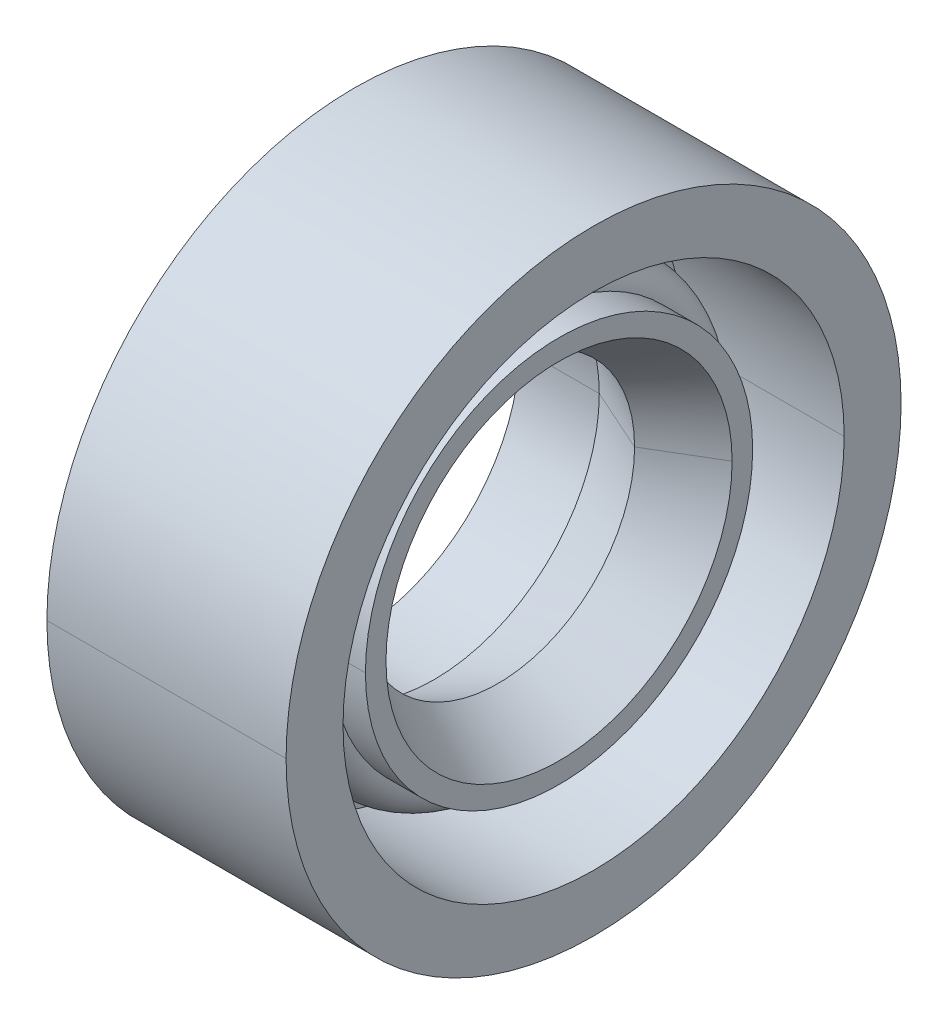
ISO-10303-21;
HEADER;
FILE_DESCRIPTION(('STEP AP214'),'2;1');
FILE_NAME('part.step','',(''),(''),'','','');
FILE_SCHEMA(('AUTOMOTIVE_DESIGN { 1 0 10303 214 1 1 1 1 }'));
ENDSEC;
DATA;
#1=APPLICATION_CONTEXT('core data for automotive mechanical design processes');
#2=APPLICATION_PROTOCOL_DEFINITION('international standard','automotive_design',2000,#1);
#3=PRODUCT_CONTEXT('',#1,'mechanical');
#4=PRODUCT('Part','Part','',(#3));
#5=PRODUCT_RELATED_PRODUCT_CATEGORY('part','',(#4));
#6=PRODUCT_DEFINITION_FORMATION('','',#4);
#7=PRODUCT_DEFINITION_CONTEXT('part definition',#1,'design');
#8=PRODUCT_DEFINITION('design','',#6,#7);
#9=PRODUCT_DEFINITION_SHAPE('','',#8);
#10=(LENGTH_UNIT() NAMED_UNIT(*) SI_UNIT(.MILLI.,.METRE.));
#11=(NAMED_UNIT(*) PLANE_ANGLE_UNIT() SI_UNIT($,.RADIAN.));
#12=(NAMED_UNIT(*) SI_UNIT($,.STERADIAN.) SOLID_ANGLE_UNIT());
#13=UNCERTAINTY_MEASURE_WITH_UNIT(LENGTH_MEASURE(1.E-05),#10,'distance_accuracy_value','');
#14=(GEOMETRIC_REPRESENTATION_CONTEXT(3) GLOBAL_UNCERTAINTY_ASSIGNED_CONTEXT((#13)) GLOBAL_UNIT_ASSIGNED_CONTEXT((#10,
#11,#12)) REPRESENTATION_CONTEXT('',''));
#15=CARTESIAN_POINT('',(0.,0.,0.));
#16=DIRECTION('',(0.,0.,1.));
#17=DIRECTION('',(1.,0.,0.));
#18=AXIS2_PLACEMENT_3D('',#15,#16,#17);
#19=CARTESIAN_POINT('',(7.,0.,0.));
#20=DIRECTION('',(1.,0.,0.));
#21=DIRECTION('',(0.,1.,0.));
#22=AXIS2_PLACEMENT_3D('',#19,#20,#21);
#23=CYLINDRICAL_SURFACE('',#22,9.);
#24=DIRECTION('',(1.,0.,0.));
#25=VECTOR('',#24,1.);
#26=CARTESIAN_POINT('',(0.,0.,9.));
#27=LINE('',#26,#25);
#28=CARTESIAN_POINT('',(0.,0.,9.));
#29=VERTEX_POINT('',#28);
#30=CARTESIAN_POINT('',(7.,0.,9.));
#31=VERTEX_POINT('',#30);
#32=EDGE_CURVE('E11',#29,#31,#27,.T.);
#33=ORIENTED_EDGE('',*,*,#32,.F.);
#34=CARTESIAN_POINT('',(0.,0.,0.));
#35=DIRECTION('',(1.,0.,0.));
#36=DIRECTION('',(0.,0.,-1.));
#37=AXIS2_PLACEMENT_3D('',#34,#35,#36);
#38=CIRCLE('',#37,9.);
#39=CARTESIAN_POINT('',(0.,0.,-9.));
#40=VERTEX_POINT('',#39);
#41=EDGE_CURVE('E25',#29,#40,#38,.T.);
#42=ORIENTED_EDGE('',*,*,#41,.T.);
#43=DIRECTION('',(1.,0.,0.));
#44=VECTOR('',#43,1.);
#45=CARTESIAN_POINT('',(0.,0.,-9.));
#46=LINE('',#45,#44);
#47=CARTESIAN_POINT('',(7.,0.,-9.));
#48=VERTEX_POINT('',#47);
#49=EDGE_CURVE('E320',#40,#48,#46,.T.);
#50=ORIENTED_EDGE('',*,*,#49,.T.);
#51=CARTESIAN_POINT('',(7.,0.,0.));
#52=DIRECTION('',(1.,0.,0.));
#53=DIRECTION('',(0.,0.,-1.));
#54=AXIS2_PLACEMENT_3D('',#51,#52,#53);
#55=CIRCLE('',#54,9.);
#56=EDGE_CURVE('E315',#31,#48,#55,.T.);
#57=ORIENTED_EDGE('',*,*,#56,.F.);
#58=EDGE_LOOP('',(#33,#42,#50,#57));
#59=FACE_BOUND('',#58,.T.);
#60=ADVANCED_FACE('F17',(#59),#23,.T.);
#61=CARTESIAN_POINT('',(7.,7.3333333333333,0.));
#62=DIRECTION('',(1.,0.,0.));
#63=DIRECTION('',(0.,0.,-1.));
#64=AXIS2_PLACEMENT_3D('',#61,#62,#63);
#65=PLANE('',#64);
#66=CARTESIAN_POINT('',(7.,0.,0.));
#67=DIRECTION('',(1.,0.,0.));
#68=DIRECTION('',(0.,0.,-1.));
#69=AXIS2_PLACEMENT_3D('',#66,#67,#68);
#70=CIRCLE('',#69,9.);
#71=EDGE_CURVE('E310',#48,#31,#70,.T.);
#72=ORIENTED_EDGE('',*,*,#71,.T.);
#73=ORIENTED_EDGE('',*,*,#56,.T.);
#74=EDGE_LOOP('',(#72,#73));
#75=FACE_BOUND('',#74,.T.);
#76=CARTESIAN_POINT('',(7.,0.,0.));
#77=DIRECTION('',(1.,0.,0.));
#78=DIRECTION('',(0.,0.,-1.));
#79=AXIS2_PLACEMENT_3D('',#76,#77,#78);
#80=CIRCLE('',#79,7.3333333333333);
#81=CARTESIAN_POINT('',(7.,0.,7.3333333333333));
#82=VERTEX_POINT('',#81);
#83=CARTESIAN_POINT('',(7.,0.,-7.3333333333333));
#84=VERTEX_POINT('',#83);
#85=EDGE_CURVE('E305',#82,#84,#80,.T.);
#86=ORIENTED_EDGE('',*,*,#85,.F.);
#87=CARTESIAN_POINT('',(7.,0.,0.));
#88=DIRECTION('',(1.,0.,0.));
#89=DIRECTION('',(0.,0.,-1.));
#90=AXIS2_PLACEMENT_3D('',#87,#88,#89);
#91=CIRCLE('',#90,7.3333333333333);
#92=EDGE_CURVE('E300',#84,#82,#91,.T.);
#93=ORIENTED_EDGE('',*,*,#92,.F.);
#94=EDGE_LOOP('',(#86,#93));
#95=FACE_BOUND('',#94,.T.);
#96=ADVANCED_FACE('F333',(#75,#95),#65,.T.);
#97=CARTESIAN_POINT('',(7.,0.,0.));
#98=DIRECTION('',(1.,0.,0.));
#99=DIRECTION('',(0.,-1.,0.));
#100=AXIS2_PLACEMENT_3D('',#97,#98,#99);
#101=CYLINDRICAL_SURFACE('',#100,7.3333333333333);
#102=DIRECTION('',(1.,0.,0.));
#103=VECTOR('',#102,1.);
#104=CARTESIAN_POINT('',(2.3333333333333,0.,7.3333333333333));
#105=LINE('',#104,#103);
#106=CARTESIAN_POINT('',(2.3333333333333,0.,7.3333333333333));
#107=VERTEX_POINT('',#106);
#108=EDGE_CURVE('E295',#107,#82,#105,.T.);
#109=ORIENTED_EDGE('',*,*,#108,.F.);
#110=CARTESIAN_POINT('',(2.3333333333333,0.,0.));
#111=DIRECTION('',(1.,0.,0.));
#112=DIRECTION('',(0.,0.,-1.));
#113=AXIS2_PLACEMENT_3D('',#110,#111,#112);
#114=CIRCLE('',#113,7.3333333333333);
#115=CARTESIAN_POINT('',(2.3333333333333,0.,-7.3333333333333));
#116=VERTEX_POINT('',#115);
#117=EDGE_CURVE('E290',#116,#107,#114,.T.);
#118=ORIENTED_EDGE('',*,*,#117,.F.);
#119=DIRECTION('',(1.,0.,0.));
#120=VECTOR('',#119,1.);
#121=CARTESIAN_POINT('',(2.3333333333333,0.,-7.3333333333333));
#122=LINE('',#121,#120);
#123=EDGE_CURVE('E285',#116,#84,#122,.T.);
#124=ORIENTED_EDGE('',*,*,#123,.T.);
#125=ORIENTED_EDGE('',*,*,#92,.T.);
#126=EDGE_LOOP('',(#109,#118,#124,#125));
#127=FACE_BOUND('',#126,.T.);
#128=ADVANCED_FACE('F336',(#127),#101,.F.);
#129=CARTESIAN_POINT('',(7.,0.,0.));
#130=DIRECTION('',(1.,0.,0.));
#131=DIRECTION('',(0.,1.,0.));
#132=AXIS2_PLACEMENT_3D('',#129,#130,#131);
#133=CYLINDRICAL_SURFACE('',#132,7.3333333333333);
#134=ORIENTED_EDGE('',*,*,#108,.T.);
#135=ORIENTED_EDGE('',*,*,#85,.T.);
#136=ORIENTED_EDGE('',*,*,#123,.F.);
#137=CARTESIAN_POINT('',(2.3333333333333,0.,0.));
#138=DIRECTION('',(1.,0.,0.));
#139=DIRECTION('',(0.,0.,-1.));
#140=AXIS2_PLACEMENT_3D('',#137,#138,#139);
#141=CIRCLE('',#140,7.3333333333333);
#142=EDGE_CURVE('E280',#107,#116,#141,.T.);
#143=ORIENTED_EDGE('',*,*,#142,.F.);
#144=EDGE_LOOP('',(#134,#135,#136,#143));
#145=FACE_BOUND('',#144,.T.);
#146=ADVANCED_FACE('F340',(#145),#133,.F.);
#147=CARTESIAN_POINT('',(2.3333333333333,5.6666666666667,0.));
#148=DIRECTION('',(1.,0.,0.));
#149=DIRECTION('',(0.,0.,-1.));
#150=AXIS2_PLACEMENT_3D('',#147,#148,#149);
#151=PLANE('',#150);
#152=ORIENTED_EDGE('',*,*,#117,.T.);
#153=ORIENTED_EDGE('',*,*,#142,.T.);
#154=EDGE_LOOP('',(#152,#153));
#155=FACE_BOUND('',#154,.T.);
#156=CARTESIAN_POINT('',(2.3333333333333,0.,0.));
#157=DIRECTION('',(1.,0.,0.));
#158=DIRECTION('',(0.,0.,-1.));
#159=AXIS2_PLACEMENT_3D('',#156,#157,#158);
#160=CIRCLE('',#159,5.6666666666667);
#161=CARTESIAN_POINT('',(2.3333333333333,0.,5.6666666666667));
#162=VERTEX_POINT('',#161);
#163=CARTESIAN_POINT('',(2.3333333333333,0.,-5.6666666666667));
#164=VERTEX_POINT('',#163);
#165=EDGE_CURVE('E275',#162,#164,#160,.T.);
#166=ORIENTED_EDGE('',*,*,#165,.F.);
#167=CARTESIAN_POINT('',(2.3333333333333,0.,0.));
#168=DIRECTION('',(1.,0.,0.));
#169=DIRECTION('',(0.,0.,-1.));
#170=AXIS2_PLACEMENT_3D('',#167,#168,#169);
#171=CIRCLE('',#170,5.6666666666667);
#172=EDGE_CURVE('E270',#164,#162,#171,.T.);
#173=ORIENTED_EDGE('',*,*,#172,.F.);
#174=EDGE_LOOP('',(#166,#173));
#175=FACE_BOUND('',#174,.T.);
#176=ADVANCED_FACE('F343',(#155,#175),#151,.T.);
#177=CARTESIAN_POINT('',(7.,0.,0.));
#178=DIRECTION('',(1.,0.,0.));
#179=DIRECTION('',(0.,-1.,0.));
#180=AXIS2_PLACEMENT_3D('',#177,#178,#179);
#181=CYLINDRICAL_SURFACE('',#180,5.6666666666667);
#182=DIRECTION('',(1.,0.,0.));
#183=VECTOR('',#182,1.);
#184=CARTESIAN_POINT('',(2.3333333333333,0.,5.6666666666667));
#185=LINE('',#184,#183);
#186=CARTESIAN_POINT('',(3.422222,0.,5.6666666666667));
#187=VERTEX_POINT('',#186);
#188=EDGE_CURVE('E266',#162,#187,#185,.T.);
#189=ORIENTED_EDGE('',*,*,#188,.T.);
#190=CARTESIAN_POINT('',(3.422222,0.,0.));
#191=DIRECTION('',(1.,0.,0.));
#192=DIRECTION('',(0.,0.,-1.));
#193=AXIS2_PLACEMENT_3D('',#190,#191,#192);
#194=CIRCLE('',#193,5.6666666666667);
#195=CARTESIAN_POINT('',(3.422222,5.3893202590059,1.75109630145804));
#196=VERTEX_POINT('',#195);
#197=EDGE_CURVE('E261',#196,#187,#194,.T.);
#198=ORIENTED_EDGE('',*,*,#197,.F.);
#199=CARTESIAN_POINT('',(3.422222,0.,0.));
#200=DIRECTION('',(1.,0.,0.));
#201=DIRECTION('',(0.,0.,-1.));
#202=AXIS2_PLACEMENT_3D('',#199,#200,#201);
#203=CIRCLE('',#202,5.6666666666667);
#204=CARTESIAN_POINT('',(3.422222,0.,-5.6666666666667));
#205=VERTEX_POINT('',#204);
#206=EDGE_CURVE('E256',#205,#196,#203,.T.);
#207=ORIENTED_EDGE('',*,*,#206,.F.);
#208=DIRECTION('',(1.,0.,0.));
#209=VECTOR('',#208,1.);
#210=CARTESIAN_POINT('',(2.3333333333333,0.,-5.6666666666667));
#211=LINE('',#210,#209);
#212=EDGE_CURVE('E251',#164,#205,#211,.T.);
#213=ORIENTED_EDGE('',*,*,#212,.F.);
#214=ORIENTED_EDGE('',*,*,#172,.T.);
#215=EDGE_LOOP('',(#189,#198,#207,#213,#214));
#216=FACE_BOUND('',#215,.T.);
#217=ADVANCED_FACE('F346',(#216),#181,.T.);
#218=CARTESIAN_POINT('',(7.,0.,0.));
#219=DIRECTION('',(1.,0.,0.));
#220=DIRECTION('',(0.,1.,0.));
#221=AXIS2_PLACEMENT_3D('',#218,#219,#220);
#222=CYLINDRICAL_SURFACE('',#221,5.6666666666667);
#223=ORIENTED_EDGE('',*,*,#188,.F.);
#224=ORIENTED_EDGE('',*,*,#165,.T.);
#225=ORIENTED_EDGE('',*,*,#212,.T.);
#226=CARTESIAN_POINT('',(3.422222,0.,0.));
#227=DIRECTION('',(1.,0.,0.));
#228=DIRECTION('',(0.,0.,-1.));
#229=AXIS2_PLACEMENT_3D('',#226,#227,#228);
#230=CIRCLE('',#229,5.6666666666667);
#231=CARTESIAN_POINT('',(3.422222,-5.3893202590059,-1.75109630145804));
#232=VERTEX_POINT('',#231);
#233=EDGE_CURVE('E246',#232,#205,#230,.T.);
#234=ORIENTED_EDGE('',*,*,#233,.F.);
#235=CARTESIAN_POINT('',(3.422222,0.,0.));
#236=DIRECTION('',(1.,0.,0.));
#237=DIRECTION('',(0.,0.,-1.));
#238=AXIS2_PLACEMENT_3D('',#235,#236,#237);
#239=CIRCLE('',#238,5.6666666666667);
#240=EDGE_CURVE('E241',#187,#232,#239,.T.);
#241=ORIENTED_EDGE('',*,*,#240,.F.);
#242=EDGE_LOOP('',(#223,#224,#225,#234,#241));
#243=FACE_BOUND('',#242,.T.);
#244=ADVANCED_FACE('F352',(#243),#222,.T.);
#245=CARTESIAN_POINT('',(4.2,0.,0.));
#246=DIRECTION('',(1.,0.,0.));
#247=DIRECTION('',(0.,0.309016994374947,-0.951056516295154));
#248=AXIS2_PLACEMENT_3D('',#245,#246,#247);
#249=TOROIDAL_SURFACE('',#248,5.6666666666667,0.777778);
#250=CARTESIAN_POINT('',(4.2,-5.3893202590059,-1.75109630145804));
#251=DIRECTION('',(0.,0.309016994374947,-0.951056516295154));
#252=DIRECTION('',(1.,0.,0.));
#253=AXIS2_PLACEMENT_3D('',#250,#251,#252);
#254=CIRCLE('',#253,0.777778);
#255=CARTESIAN_POINT('',(4.977778,-5.3893202590059,-1.75109630145804));
#256=VERTEX_POINT('',#255);
#257=EDGE_CURVE('E236',#256,#232,#254,.T.);
#258=ORIENTED_EDGE('',*,*,#257,.F.);
#259=CARTESIAN_POINT('',(4.977778,0.,0.));
#260=DIRECTION('',(1.,0.,0.));
#261=DIRECTION('',(0.,0.,-1.));
#262=AXIS2_PLACEMENT_3D('',#259,#260,#261);
#263=CIRCLE('',#262,5.6666666666667);
#264=CARTESIAN_POINT('',(4.977778,0.,5.6666666666667));
#265=VERTEX_POINT('',#264);
#266=EDGE_CURVE('E231',#265,#256,#263,.T.);
#267=ORIENTED_EDGE('',*,*,#266,.F.);
#268=CARTESIAN_POINT('',(4.977778,0.,0.));
#269=DIRECTION('',(1.,0.,0.));
#270=DIRECTION('',(0.,0.,-1.));
#271=AXIS2_PLACEMENT_3D('',#268,#269,#270);
#272=CIRCLE('',#271,5.6666666666667);
#273=CARTESIAN_POINT('',(4.977778,5.3893202590059,1.75109630145805));
#274=VERTEX_POINT('',#273);
#275=EDGE_CURVE('E226',#274,#265,#272,.T.);
#276=ORIENTED_EDGE('',*,*,#275,.F.);
#277=CARTESIAN_POINT('',(4.2,5.3893202590059,1.75109630145805));
#278=DIRECTION('',(0.,-0.309016994374947,0.951056516295154));
#279=DIRECTION('',(1.,0.,0.));
#280=AXIS2_PLACEMENT_3D('',#277,#278,#279);
#281=CIRCLE('',#280,0.777778);
#282=EDGE_CURVE('E221',#274,#196,#281,.T.);
#283=ORIENTED_EDGE('',*,*,#282,.T.);
#284=ORIENTED_EDGE('',*,*,#197,.T.);
#285=ORIENTED_EDGE('',*,*,#240,.T.);
#286=EDGE_LOOP('',(#258,#267,#276,#283,#284,#285));
#287=FACE_BOUND('',#286,.T.);
#288=ADVANCED_FACE('F359',(#287),#249,.T.);
#289=CARTESIAN_POINT('',(4.2,0.,0.));
#290=DIRECTION('',(1.,0.,0.));
#291=DIRECTION('',(0.,-0.309016994374947,0.951056516295154));
#292=AXIS2_PLACEMENT_3D('',#289,#290,#291);
#293=TOROIDAL_SURFACE('',#292,5.6666666666667,0.777778);
#294=ORIENTED_EDGE('',*,*,#257,.T.);
#295=ORIENTED_EDGE('',*,*,#233,.T.);
#296=ORIENTED_EDGE('',*,*,#206,.T.);
#297=ORIENTED_EDGE('',*,*,#282,.F.);
#298=CARTESIAN_POINT('',(4.977778,0.,0.));
#299=DIRECTION('',(1.,0.,0.));
#300=DIRECTION('',(0.,0.,-1.));
#301=AXIS2_PLACEMENT_3D('',#298,#299,#300);
#302=CIRCLE('',#301,5.6666666666667);
#303=CARTESIAN_POINT('',(4.977778,0.,-5.6666666666667));
#304=VERTEX_POINT('',#303);
#305=EDGE_CURVE('E216',#304,#274,#302,.T.);
#306=ORIENTED_EDGE('',*,*,#305,.F.);
#307=CARTESIAN_POINT('',(4.977778,0.,0.));
#308=DIRECTION('',(1.,0.,0.));
#309=DIRECTION('',(0.,0.,-1.));
#310=AXIS2_PLACEMENT_3D('',#307,#308,#309);
#311=CIRCLE('',#310,5.6666666666667);
#312=EDGE_CURVE('E211',#256,#304,#311,.T.);
#313=ORIENTED_EDGE('',*,*,#312,.F.);
#314=EDGE_LOOP('',(#294,#295,#296,#297,#306,#313));
#315=FACE_BOUND('',#314,.T.);
#316=ADVANCED_FACE('F355',(#315),#293,.T.);
#317=CARTESIAN_POINT('',(7.,0.,0.));
#318=DIRECTION('',(1.,0.,0.));
#319=DIRECTION('',(0.,1.,0.));
#320=AXIS2_PLACEMENT_3D('',#317,#318,#319);
#321=CYLINDRICAL_SURFACE('',#320,5.6666666666667);
#322=DIRECTION('',(1.,0.,0.));
#323=VECTOR('',#322,1.);
#324=CARTESIAN_POINT('',(4.977778,0.,5.6666666666667));
#325=LINE('',#324,#323);
#326=CARTESIAN_POINT('',(5.988889,0.,5.6666666666667));
#327=VERTEX_POINT('',#326);
#328=EDGE_CURVE('E206',#265,#327,#325,.T.);
#329=ORIENTED_EDGE('',*,*,#328,.F.);
#330=ORIENTED_EDGE('',*,*,#266,.T.);
#331=ORIENTED_EDGE('',*,*,#312,.T.);
#332=DIRECTION('',(1.,0.,0.));
#333=VECTOR('',#332,1.);
#334=CARTESIAN_POINT('',(4.977778,0.,-5.6666666666667));
#335=LINE('',#334,#333);
#336=CARTESIAN_POINT('',(5.988889,0.,-5.6666666666667));
#337=VERTEX_POINT('',#336);
#338=EDGE_CURVE('E202',#304,#337,#335,.T.);
#339=ORIENTED_EDGE('',*,*,#338,.T.);
#340=CARTESIAN_POINT('',(5.988889,0.,0.));
#341=DIRECTION('',(1.,0.,0.));
#342=DIRECTION('',(0.,0.,-1.));
#343=AXIS2_PLACEMENT_3D('',#340,#341,#342);
#344=CIRCLE('',#343,5.6666666666667);
#345=EDGE_CURVE('E197',#327,#337,#344,.T.);
#346=ORIENTED_EDGE('',*,*,#345,.F.);
#347=EDGE_LOOP('',(#329,#330,#331,#339,#346));
#348=FACE_BOUND('',#347,.T.);
#349=ADVANCED_FACE('F364',(#348),#321,.T.);
#350=CARTESIAN_POINT('',(5.988889,5.0648148809524,0.));
#351=DIRECTION('',(1.,0.,0.));
#352=DIRECTION('',(0.,0.,-1.));
#353=AXIS2_PLACEMENT_3D('',#350,#351,#352);
#354=PLANE('',#353);
#355=CARTESIAN_POINT('',(5.988889,0.,0.));
#356=DIRECTION('',(1.,0.,0.));
#357=DIRECTION('',(0.,0.,-1.));
#358=AXIS2_PLACEMENT_3D('',#355,#356,#357);
#359=CIRCLE('',#358,5.6666666666667);
#360=EDGE_CURVE('E192',#337,#327,#359,.T.);
#361=ORIENTED_EDGE('',*,*,#360,.T.);
#362=ORIENTED_EDGE('',*,*,#345,.T.);
#363=EDGE_LOOP('',(#361,#362));
#364=FACE_BOUND('',#363,.T.);
#365=CARTESIAN_POINT('',(5.988889,0.,0.));
#366=DIRECTION('',(1.,0.,0.));
#367=DIRECTION('',(0.,0.,-1.));
#368=AXIS2_PLACEMENT_3D('',#365,#366,#367);
#369=CIRCLE('',#368,5.0648148809524);
#370=CARTESIAN_POINT('',(5.988889,0.,5.0648148809524));
#371=VERTEX_POINT('',#370);
#372=CARTESIAN_POINT('',(5.988889,0.,-5.0648148809524));
#373=VERTEX_POINT('',#372);
#374=EDGE_CURVE('E187',#371,#373,#369,.T.);
#375=ORIENTED_EDGE('',*,*,#374,.F.);
#376=CARTESIAN_POINT('',(5.988889,0.,0.));
#377=DIRECTION('',(1.,0.,0.));
#378=DIRECTION('',(0.,0.,-1.));
#379=AXIS2_PLACEMENT_3D('',#376,#377,#378);
#380=CIRCLE('',#379,5.0648148809524);
#381=EDGE_CURVE('E182',#373,#371,#380,.T.);
#382=ORIENTED_EDGE('',*,*,#381,.F.);
#383=EDGE_LOOP('',(#375,#382));
#384=FACE_BOUND('',#383,.T.);
#385=ADVANCED_FACE('F368',(#364,#384),#354,.T.);
#386=CARTESIAN_POINT('',(4.2,0.,0.));
#387=DIRECTION('',(1.,0.,0.));
#388=DIRECTION('',(0.,-1.,0.));
#389=AXIS2_PLACEMENT_3D('',#386,#387,#388);
#390=CONICAL_SURFACE('',#389,4.,0.536910742740053);
#391=DIRECTION('',(0.859292884409703,0.,0.511483859767689));
#392=VECTOR('',#391,1.);
#393=CARTESIAN_POINT('',(4.2,0.,4.));
#394=LINE('',#393,#392);
#395=CARTESIAN_POINT('',(4.2,0.,4.));
#396=VERTEX_POINT('',#395);
#397=EDGE_CURVE('E177',#396,#371,#394,.T.);
#398=ORIENTED_EDGE('',*,*,#397,.F.);
#399=CARTESIAN_POINT('',(4.2,0.,0.));
#400=DIRECTION('',(1.,0.,0.));
#401=DIRECTION('',(0.,0.,-1.));
#402=AXIS2_PLACEMENT_3D('',#399,#400,#401);
#403=CIRCLE('',#402,4.);
#404=CARTESIAN_POINT('',(4.2,0.,-4.));
#405=VERTEX_POINT('',#404);
#406=EDGE_CURVE('E172',#405,#396,#403,.T.);
#407=ORIENTED_EDGE('',*,*,#406,.F.);
#408=DIRECTION('',(0.859292884409703,0.,-0.511483859767689));
#409=VECTOR('',#408,1.);
#410=CARTESIAN_POINT('',(4.2,0.,-4.));
#411=LINE('',#410,#409);
#412=EDGE_CURVE('E167',#405,#373,#411,.T.);
#413=ORIENTED_EDGE('',*,*,#412,.T.);
#414=ORIENTED_EDGE('',*,*,#381,.T.);
#415=EDGE_LOOP('',(#398,#407,#413,#414));
#416=FACE_BOUND('',#415,.T.);
#417=ADVANCED_FACE('F371',(#416),#390,.F.);
#418=CARTESIAN_POINT('',(4.2,0.,0.));
#419=DIRECTION('',(1.,0.,0.));
#420=DIRECTION('',(0.,1.,0.));
#421=AXIS2_PLACEMENT_3D('',#418,#419,#420);
#422=CONICAL_SURFACE('',#421,4.,0.536910742740053);
#423=ORIENTED_EDGE('',*,*,#397,.T.);
#424=ORIENTED_EDGE('',*,*,#374,.T.);
#425=ORIENTED_EDGE('',*,*,#412,.F.);
#426=CARTESIAN_POINT('',(4.2,0.,0.));
#427=DIRECTION('',(1.,0.,0.));
#428=DIRECTION('',(0.,0.,-1.));
#429=AXIS2_PLACEMENT_3D('',#426,#427,#428);
#430=CIRCLE('',#429,4.);
#431=EDGE_CURVE('E162',#396,#405,#430,.T.);
#432=ORIENTED_EDGE('',*,*,#431,.F.);
#433=EDGE_LOOP('',(#423,#424,#425,#432));
#434=FACE_BOUND('',#433,.T.);
#435=ADVANCED_FACE('F376',(#434),#422,.F.);
#436=CARTESIAN_POINT('',(2.3333333333333,0.,0.));
#437=DIRECTION('',(-1.,0.,0.));
#438=DIRECTION('',(0.,1.,0.));
#439=AXIS2_PLACEMENT_3D('',#436,#437,#438);
#440=CONICAL_SURFACE('',#439,4.8333333333333,0.41987995720553);
#441=DIRECTION('',(-0.91313788243752,0.,-0.40765084037387));
#442=VECTOR('',#441,1.);
#443=CARTESIAN_POINT('',(4.2,0.,-4.));
#444=LINE('',#443,#442);
#445=CARTESIAN_POINT('',(2.3333333333333,0.,-4.8333333333333));
#446=VERTEX_POINT('',#445);
#447=EDGE_CURVE('E158',#405,#446,#444,.T.);
#448=ORIENTED_EDGE('',*,*,#447,.T.);
#449=CARTESIAN_POINT('',(2.3333333333333,0.,0.));
#450=DIRECTION('',(1.,0.,0.));
#451=DIRECTION('',(0.,0.,-1.));
#452=AXIS2_PLACEMENT_3D('',#449,#450,#451);
#453=CIRCLE('',#452,4.8333333333333);
#454=CARTESIAN_POINT('',(2.3333333333333,0.,4.8333333333333));
#455=VERTEX_POINT('',#454);
#456=EDGE_CURVE('E129',#455,#446,#453,.T.);
#457=ORIENTED_EDGE('',*,*,#456,.F.);
#458=DIRECTION('',(-0.91313788243752,0.,0.40765084037387));
#459=VECTOR('',#458,1.);
#460=CARTESIAN_POINT('',(4.2,0.,4.));
#461=LINE('',#460,#459);
#462=EDGE_CURVE('E150',#396,#455,#461,.T.);
#463=ORIENTED_EDGE('',*,*,#462,.F.);
#464=ORIENTED_EDGE('',*,*,#431,.T.);
#465=EDGE_LOOP('',(#448,#457,#463,#464));
#466=FACE_BOUND('',#465,.T.);
#467=ADVANCED_FACE('F381',(#466),#440,.F.);
#468=CARTESIAN_POINT('',(2.3333333333333,0.,0.));
#469=DIRECTION('',(-1.,0.,0.));
#470=DIRECTION('',(0.,-1.,0.));
#471=AXIS2_PLACEMENT_3D('',#468,#469,#470);
#472=CONICAL_SURFACE('',#471,4.8333333333333,0.41987995720553);
#473=ORIENTED_EDGE('',*,*,#447,.F.);
#474=ORIENTED_EDGE('',*,*,#406,.T.);
#475=ORIENTED_EDGE('',*,*,#462,.T.);
#476=CARTESIAN_POINT('',(2.3333333333333,0.,0.));
#477=DIRECTION('',(1.,0.,0.));
#478=DIRECTION('',(0.,0.,-1.));
#479=AXIS2_PLACEMENT_3D('',#476,#477,#478);
#480=CIRCLE('',#479,4.8333333333333);
#481=EDGE_CURVE('E146',#446,#455,#480,.T.);
#482=ORIENTED_EDGE('',*,*,#481,.F.);
#483=EDGE_LOOP('',(#473,#474,#475,#482));
#484=FACE_BOUND('',#483,.T.);
#485=ADVANCED_FACE('F384',(#484),#472,.F.);
#486=CARTESIAN_POINT('',(7.,0.,0.));
#487=DIRECTION('',(1.,0.,0.));
#488=DIRECTION('',(0.,-1.,-2.38000347378074E-10));
#489=AXIS2_PLACEMENT_3D('',#486,#487,#488);
#490=CYLINDRICAL_SURFACE('',#489,4.8333333333333);
#491=DIRECTION('',(1.,0.,0.));
#492=VECTOR('',#491,1.);
#493=CARTESIAN_POINT('',(0.,0.,4.8333333333333));
#494=LINE('',#493,#492);
#495=CARTESIAN_POINT('',(0.,0.,4.8333333333333));
#496=VERTEX_POINT('',#495);
#497=EDGE_CURVE('E121',#496,#455,#494,.T.);
#498=ORIENTED_EDGE('',*,*,#497,.F.);
#499=CARTESIAN_POINT('',(0.,0.,0.));
#500=DIRECTION('',(1.,0.,0.));
#501=DIRECTION('',(0.,0.,-1.));
#502=AXIS2_PLACEMENT_3D('',#499,#500,#501);
#503=CIRCLE('',#502,4.8333333333333);
#504=CARTESIAN_POINT('',(0.,0.,-4.8333333333333));
#505=VERTEX_POINT('',#504);
#506=EDGE_CURVE('E114',#505,#496,#503,.T.);
#507=ORIENTED_EDGE('',*,*,#506,.F.);
#508=DIRECTION('',(1.,0.,0.));
#509=VECTOR('',#508,1.);
#510=CARTESIAN_POINT('',(0.,0.,-4.8333333333333));
#511=LINE('',#510,#509);
#512=EDGE_CURVE('E118',#505,#446,#511,.T.);
#513=ORIENTED_EDGE('',*,*,#512,.T.);
#514=ORIENTED_EDGE('',*,*,#481,.T.);
#515=EDGE_LOOP('',(#498,#507,#513,#514));
#516=FACE_BOUND('',#515,.T.);
#517=ADVANCED_FACE('F116',(#516),#490,.F.);
#518=CARTESIAN_POINT('',(7.,0.,0.));
#519=DIRECTION('',(1.,0.,0.));
#520=DIRECTION('',(0.,1.,0.));
#521=AXIS2_PLACEMENT_3D('',#518,#519,#520);
#522=CYLINDRICAL_SURFACE('',#521,4.8333333333333);
#523=ORIENTED_EDGE('',*,*,#497,.T.);
#524=ORIENTED_EDGE('',*,*,#456,.T.);
#525=ORIENTED_EDGE('',*,*,#512,.F.);
#526=CARTESIAN_POINT('',(0.,0.,0.));
#527=DIRECTION('',(1.,0.,0.));
#528=DIRECTION('',(0.,0.,-1.));
#529=AXIS2_PLACEMENT_3D('',#526,#527,#528);
#530=CIRCLE('',#529,4.8333333333333);
#531=EDGE_CURVE('E128',#496,#505,#530,.T.);
#532=ORIENTED_EDGE('',*,*,#531,.F.);
#533=EDGE_LOOP('',(#523,#524,#525,#532));
#534=FACE_BOUND('',#533,.T.);
#535=ADVANCED_FACE('F127',(#534),#522,.F.);
#536=CARTESIAN_POINT('',(0.,9.,0.));
#537=DIRECTION('',(-1.,0.,0.));
#538=DIRECTION('',(0.,0.,1.));
#539=AXIS2_PLACEMENT_3D('',#536,#537,#538);
#540=PLANE('',#539);
#541=ORIENTED_EDGE('',*,*,#506,.T.);
#542=ORIENTED_EDGE('',*,*,#531,.T.);
#543=EDGE_LOOP('',(#541,#542));
#544=FACE_BOUND('',#543,.T.);
#545=ORIENTED_EDGE('',*,*,#41,.F.);
#546=CARTESIAN_POINT('',(0.,0.,0.));
#547=DIRECTION('',(1.,0.,0.));
#548=DIRECTION('',(0.,0.,-1.));
#549=AXIS2_PLACEMENT_3D('',#546,#547,#548);
#550=CIRCLE('',#549,9.);
#551=EDGE_CURVE('E133',#40,#29,#550,.T.);
#552=ORIENTED_EDGE('',*,*,#551,.F.);
#553=EDGE_LOOP('',(#545,#552));
#554=FACE_BOUND('',#553,.T.);
#555=ADVANCED_FACE('F131',(#544,#554),#540,.T.);
#556=CARTESIAN_POINT('',(7.,0.,0.));
#557=DIRECTION('',(1.,0.,0.));
#558=DIRECTION('',(0.,-1.,0.));
#559=AXIS2_PLACEMENT_3D('',#556,#557,#558);
#560=CYLINDRICAL_SURFACE('',#559,9.);
#561=ORIENTED_EDGE('',*,*,#32,.T.);
#562=ORIENTED_EDGE('',*,*,#71,.F.);
#563=ORIENTED_EDGE('',*,*,#49,.F.);
#564=ORIENTED_EDGE('',*,*,#551,.T.);
#565=EDGE_LOOP('',(#561,#562,#563,#564));
#566=FACE_BOUND('',#565,.T.);
#567=ADVANCED_FACE('F331',(#566),#560,.T.);
#568=CARTESIAN_POINT('',(7.,0.,0.));
#569=DIRECTION('',(1.,0.,0.));
#570=DIRECTION('',(0.,-1.,0.));
#571=AXIS2_PLACEMENT_3D('',#568,#569,#570);
#572=CYLINDRICAL_SURFACE('',#571,5.6666666666667);
#573=ORIENTED_EDGE('',*,*,#328,.T.);
#574=ORIENTED_EDGE('',*,*,#360,.F.);
#575=ORIENTED_EDGE('',*,*,#338,.F.);
#576=ORIENTED_EDGE('',*,*,#305,.T.);
#577=ORIENTED_EDGE('',*,*,#275,.T.);
#578=EDGE_LOOP('',(#573,#574,#575,#576,#577));
#579=FACE_BOUND('',#578,.T.);
#580=ADVANCED_FACE('F366',(#579),#572,.T.);
#581=CLOSED_SHELL('',(#60,#96,#128,#146,#176,#217,#244,#288,#316,#349,#385,#417,#435,#467,#485,
#517,#535,#555,#567,#580));
#582=MANIFOLD_SOLID_BREP('B1',#581);
#583=ADVANCED_BREP_SHAPE_REPRESENTATION('',(#18,#582),#14);
#584=SHAPE_DEFINITION_REPRESENTATION(#9,#583);
ENDSEC;
END-ISO-10303-21;
